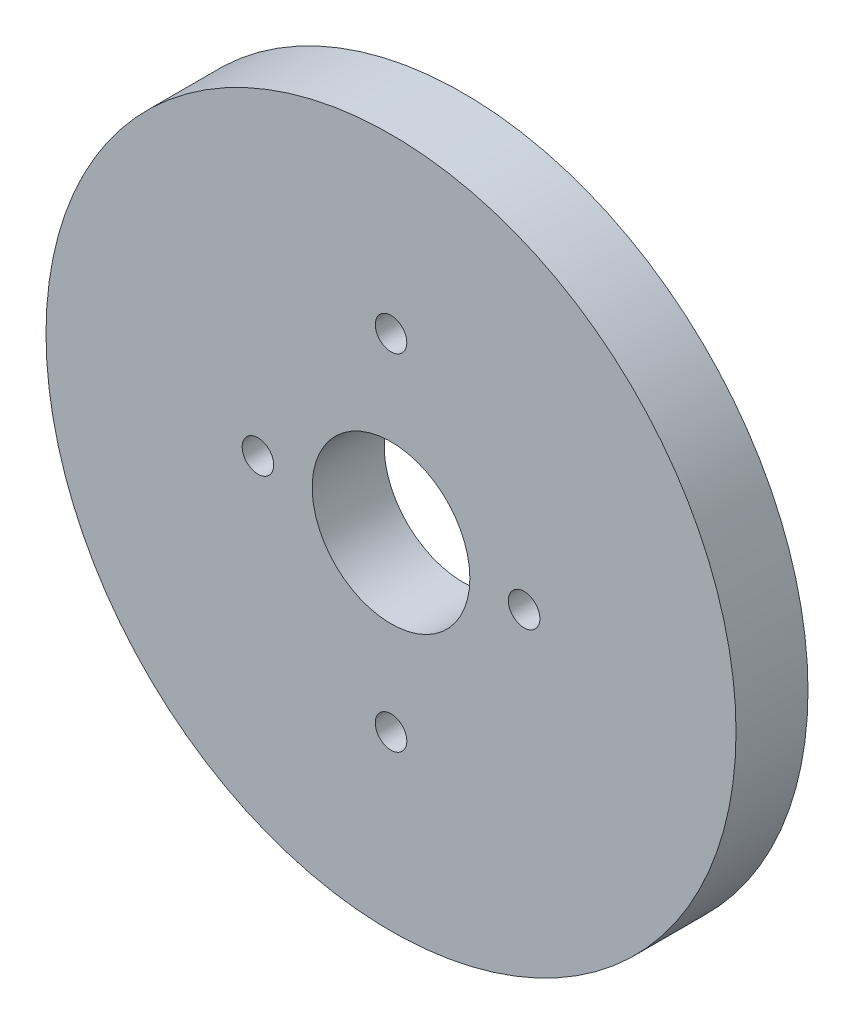
ISO-10303-21;
HEADER;
FILE_DESCRIPTION(('STEP AP214'),'2;1');
FILE_NAME('part.step','',(''),(''),'','','');
FILE_SCHEMA(('AUTOMOTIVE_DESIGN { 1 0 10303 214 1 1 1 1 }'));
ENDSEC;
DATA;
#1=APPLICATION_CONTEXT('core data for automotive mechanical design processes');
#2=APPLICATION_PROTOCOL_DEFINITION('international standard','automotive_design',2000,#1);
#3=PRODUCT_CONTEXT('',#1,'mechanical');
#4=PRODUCT('Part','Part','',(#3));
#5=PRODUCT_RELATED_PRODUCT_CATEGORY('part','',(#4));
#6=PRODUCT_DEFINITION_FORMATION('','',#4);
#7=PRODUCT_DEFINITION_CONTEXT('part definition',#1,'design');
#8=PRODUCT_DEFINITION('design','',#6,#7);
#9=PRODUCT_DEFINITION_SHAPE('','',#8);
#10=(LENGTH_UNIT() NAMED_UNIT(*) SI_UNIT(.MILLI.,.METRE.));
#11=(NAMED_UNIT(*) PLANE_ANGLE_UNIT() SI_UNIT($,.RADIAN.));
#12=(NAMED_UNIT(*) SI_UNIT($,.STERADIAN.) SOLID_ANGLE_UNIT());
#13=UNCERTAINTY_MEASURE_WITH_UNIT(LENGTH_MEASURE(1.E-05),#10,'distance_accuracy_value','');
#14=(GEOMETRIC_REPRESENTATION_CONTEXT(3) GLOBAL_UNCERTAINTY_ASSIGNED_CONTEXT((#13)) GLOBAL_UNIT_ASSIGNED_CONTEXT((#10,
#11,#12)) REPRESENTATION_CONTEXT('',''));
#15=CARTESIAN_POINT('',(0.,0.,0.));
#16=DIRECTION('',(0.,0.,1.));
#17=DIRECTION('',(1.,0.,0.));
#18=AXIS2_PLACEMENT_3D('',#15,#16,#17);
#19=CARTESIAN_POINT('',(0.,0.,3.65));
#20=DIRECTION('',(0.,0.,1.));
#21=DIRECTION('',(1.,0.,0.));
#22=AXIS2_PLACEMENT_3D('',#19,#20,#21);
#23=PLANE('',#22);
#24=CARTESIAN_POINT('',(0.,-8.75,3.65));
#25=DIRECTION('',(0.,0.,1.));
#26=DIRECTION('',(-1.,0.,0.));
#27=AXIS2_PLACEMENT_3D('',#24,#25,#26);
#28=CIRCLE('',#27,0.8);
#29=CARTESIAN_POINT('',(-0.8,-8.75,3.65));
#30=VERTEX_POINT('',#29);
#31=EDGE_CURVE('E67',#30,#30,#28,.T.);
#32=ORIENTED_EDGE('',*,*,#31,.F.);
#33=EDGE_LOOP('',(#32));
#34=FACE_BOUND('',#33,.T.);
#35=CARTESIAN_POINT('',(6.75,0.,3.65));
#36=DIRECTION('',(0.,0.,1.));
#37=DIRECTION('',(1.,0.,0.));
#38=AXIS2_PLACEMENT_3D('',#35,#36,#37);
#39=CIRCLE('',#38,0.8);
#40=CARTESIAN_POINT('',(7.55,0.,3.65));
#41=VERTEX_POINT('',#40);
#42=EDGE_CURVE('E55',#41,#41,#39,.T.);
#43=ORIENTED_EDGE('',*,*,#42,.F.);
#44=EDGE_LOOP('',(#43));
#45=FACE_BOUND('',#44,.T.);
#46=CARTESIAN_POINT('',(0.,0.,3.65));
#47=DIRECTION('',(0.,0.,1.));
#48=DIRECTION('',(1.,0.,0.));
#49=AXIS2_PLACEMENT_3D('',#46,#47,#48);
#50=CIRCLE('',#49,17.5);
#51=CARTESIAN_POINT('',(17.5,0.,3.65));
#52=VERTEX_POINT('',#51);
#53=EDGE_CURVE('E10',#52,#52,#50,.T.);
#54=ORIENTED_EDGE('',*,*,#53,.T.);
#55=EDGE_LOOP('',(#54));
#56=FACE_BOUND('',#55,.T.);
#57=CARTESIAN_POINT('',(0.,0.,3.65));
#58=DIRECTION('',(0.,0.,1.));
#59=DIRECTION('',(1.,0.,0.));
#60=AXIS2_PLACEMENT_3D('',#57,#58,#59);
#61=CIRCLE('',#60,4.);
#62=CARTESIAN_POINT('',(4.,0.,3.65));
#63=VERTEX_POINT('',#62);
#64=EDGE_CURVE('E50',#63,#63,#61,.T.);
#65=ORIENTED_EDGE('',*,*,#64,.F.);
#66=EDGE_LOOP('',(#65));
#67=FACE_BOUND('',#66,.T.);
#68=CARTESIAN_POINT('',(0.,8.75,3.65));
#69=DIRECTION('',(0.,0.,1.));
#70=DIRECTION('',(1.,0.,0.));
#71=AXIS2_PLACEMENT_3D('',#68,#69,#70);
#72=CIRCLE('',#71,0.8);
#73=CARTESIAN_POINT('',(0.8,8.75,3.65));
#74=VERTEX_POINT('',#73);
#75=EDGE_CURVE('E61',#74,#74,#72,.T.);
#76=ORIENTED_EDGE('',*,*,#75,.F.);
#77=EDGE_LOOP('',(#76));
#78=FACE_BOUND('',#77,.T.);
#79=CARTESIAN_POINT('',(-6.75,0.,3.65));
#80=DIRECTION('',(0.,0.,1.));
#81=DIRECTION('',(-1.,0.,0.));
#82=AXIS2_PLACEMENT_3D('',#79,#80,#81);
#83=CIRCLE('',#82,0.8);
#84=CARTESIAN_POINT('',(-7.55,0.,3.65));
#85=VERTEX_POINT('',#84);
#86=EDGE_CURVE('E73',#85,#85,#83,.T.);
#87=ORIENTED_EDGE('',*,*,#86,.F.);
#88=EDGE_LOOP('',(#87));
#89=FACE_BOUND('',#88,.T.);
#90=ADVANCED_FACE('F39',(#34,#45,#56,#67,#78,#89),#23,.T.);
#91=CARTESIAN_POINT('',(0.,0.,0.));
#92=DIRECTION('',(0.,0.,1.));
#93=DIRECTION('',(1.,0.,0.));
#94=AXIS2_PLACEMENT_3D('',#91,#92,#93);
#95=PLANE('',#94);
#96=CARTESIAN_POINT('',(0.,0.,0.));
#97=DIRECTION('',(0.,0.,1.));
#98=DIRECTION('',(1.,0.,0.));
#99=AXIS2_PLACEMENT_3D('',#96,#97,#98);
#100=CIRCLE('',#99,17.5);
#101=CARTESIAN_POINT('',(17.5,0.,0.));
#102=VERTEX_POINT('',#101);
#103=EDGE_CURVE('E43',#102,#102,#100,.T.);
#104=ORIENTED_EDGE('',*,*,#103,.F.);
#105=EDGE_LOOP('',(#104));
#106=FACE_BOUND('',#105,.T.);
#107=CARTESIAN_POINT('',(0.,0.,0.));
#108=DIRECTION('',(0.,0.,1.));
#109=DIRECTION('',(1.,0.,0.));
#110=AXIS2_PLACEMENT_3D('',#107,#108,#109);
#111=CIRCLE('',#110,4.);
#112=CARTESIAN_POINT('',(4.,0.,0.));
#113=VERTEX_POINT('',#112);
#114=EDGE_CURVE('E52',#113,#113,#111,.T.);
#115=ORIENTED_EDGE('',*,*,#114,.T.);
#116=EDGE_LOOP('',(#115));
#117=FACE_BOUND('',#116,.T.);
#118=CARTESIAN_POINT('',(6.75,0.,0.));
#119=DIRECTION('',(0.,0.,1.));
#120=DIRECTION('',(1.,0.,0.));
#121=AXIS2_PLACEMENT_3D('',#118,#119,#120);
#122=CIRCLE('',#121,0.8);
#123=CARTESIAN_POINT('',(7.55,0.,0.));
#124=VERTEX_POINT('',#123);
#125=EDGE_CURVE('E58',#124,#124,#122,.T.);
#126=ORIENTED_EDGE('',*,*,#125,.T.);
#127=EDGE_LOOP('',(#126));
#128=FACE_BOUND('',#127,.T.);
#129=CARTESIAN_POINT('',(0.,8.75,0.));
#130=DIRECTION('',(0.,0.,1.));
#131=DIRECTION('',(1.,0.,0.));
#132=AXIS2_PLACEMENT_3D('',#129,#130,#131);
#133=CIRCLE('',#132,0.8);
#134=CARTESIAN_POINT('',(0.8,8.75,0.));
#135=VERTEX_POINT('',#134);
#136=EDGE_CURVE('E64',#135,#135,#133,.T.);
#137=ORIENTED_EDGE('',*,*,#136,.T.);
#138=EDGE_LOOP('',(#137));
#139=FACE_BOUND('',#138,.T.);
#140=CARTESIAN_POINT('',(0.,-8.75,0.));
#141=DIRECTION('',(0.,0.,1.));
#142=DIRECTION('',(-1.,0.,0.));
#143=AXIS2_PLACEMENT_3D('',#140,#141,#142);
#144=CIRCLE('',#143,0.8);
#145=CARTESIAN_POINT('',(-0.8,-8.75,0.));
#146=VERTEX_POINT('',#145);
#147=EDGE_CURVE('E70',#146,#146,#144,.T.);
#148=ORIENTED_EDGE('',*,*,#147,.T.);
#149=EDGE_LOOP('',(#148));
#150=FACE_BOUND('',#149,.T.);
#151=CARTESIAN_POINT('',(-6.75,0.,0.));
#152=DIRECTION('',(0.,0.,1.));
#153=DIRECTION('',(-1.,0.,0.));
#154=AXIS2_PLACEMENT_3D('',#151,#152,#153);
#155=CIRCLE('',#154,0.8);
#156=CARTESIAN_POINT('',(-7.55,0.,0.));
#157=VERTEX_POINT('',#156);
#158=EDGE_CURVE('E76',#157,#157,#155,.T.);
#159=ORIENTED_EDGE('',*,*,#158,.T.);
#160=EDGE_LOOP('',(#159));
#161=FACE_BOUND('',#160,.T.);
#162=ADVANCED_FACE('F86',(#106,#117,#128,#139,#150,#161),#95,.F.);
#163=CARTESIAN_POINT('',(0.,0.,3.65));
#164=DIRECTION('',(0.,0.,-1.));
#165=DIRECTION('',(-1.,0.,0.));
#166=AXIS2_PLACEMENT_3D('',#163,#164,#165);
#167=CYLINDRICAL_SURFACE('',#166,17.5);
#168=ORIENTED_EDGE('',*,*,#53,.F.);
#169=EDGE_LOOP('',(#168));
#170=FACE_BOUND('',#169,.T.);
#171=ORIENTED_EDGE('',*,*,#103,.T.);
#172=EDGE_LOOP('',(#171));
#173=FACE_BOUND('',#172,.T.);
#174=ADVANCED_FACE('F41',(#170,#173),#167,.T.);
#175=CARTESIAN_POINT('',(0.,0.,3.65));
#176=DIRECTION('',(0.,0.,-1.));
#177=DIRECTION('',(-1.,0.,0.));
#178=AXIS2_PLACEMENT_3D('',#175,#176,#177);
#179=CYLINDRICAL_SURFACE('',#178,4.);
#180=ORIENTED_EDGE('',*,*,#64,.T.);
#181=EDGE_LOOP('',(#180));
#182=FACE_BOUND('',#181,.T.);
#183=ORIENTED_EDGE('',*,*,#114,.F.);
#184=EDGE_LOOP('',(#183));
#185=FACE_BOUND('',#184,.T.);
#186=ADVANCED_FACE('F96',(#182,#185),#179,.F.);
#187=CARTESIAN_POINT('',(6.75,0.,3.65));
#188=DIRECTION('',(0.,0.,-1.));
#189=DIRECTION('',(-1.,0.,0.));
#190=AXIS2_PLACEMENT_3D('',#187,#188,#189);
#191=CYLINDRICAL_SURFACE('',#190,0.8);
#192=ORIENTED_EDGE('',*,*,#42,.T.);
#193=EDGE_LOOP('',(#192));
#194=FACE_BOUND('',#193,.T.);
#195=ORIENTED_EDGE('',*,*,#125,.F.);
#196=EDGE_LOOP('',(#195));
#197=FACE_BOUND('',#196,.T.);
#198=ADVANCED_FACE('F99',(#194,#197),#191,.F.);
#199=CARTESIAN_POINT('',(0.,8.75,3.65));
#200=DIRECTION('',(0.,0.,-1.));
#201=DIRECTION('',(-1.,0.,0.));
#202=AXIS2_PLACEMENT_3D('',#199,#200,#201);
#203=CYLINDRICAL_SURFACE('',#202,0.8);
#204=ORIENTED_EDGE('',*,*,#75,.T.);
#205=EDGE_LOOP('',(#204));
#206=FACE_BOUND('',#205,.T.);
#207=ORIENTED_EDGE('',*,*,#136,.F.);
#208=EDGE_LOOP('',(#207));
#209=FACE_BOUND('',#208,.T.);
#210=ADVANCED_FACE('F103',(#206,#209),#203,.F.);
#211=CARTESIAN_POINT('',(0.,-8.75,3.65));
#212=DIRECTION('',(0.,0.,-1.));
#213=DIRECTION('',(-1.,0.,0.));
#214=AXIS2_PLACEMENT_3D('',#211,#212,#213);
#215=CYLINDRICAL_SURFACE('',#214,0.8);
#216=ORIENTED_EDGE('',*,*,#31,.T.);
#217=EDGE_LOOP('',(#216));
#218=FACE_BOUND('',#217,.T.);
#219=ORIENTED_EDGE('',*,*,#147,.F.);
#220=EDGE_LOOP('',(#219));
#221=FACE_BOUND('',#220,.T.);
#222=ADVANCED_FACE('F107',(#218,#221),#215,.F.);
#223=CARTESIAN_POINT('',(-6.75,0.,3.65));
#224=DIRECTION('',(0.,0.,-1.));
#225=DIRECTION('',(-1.,0.,0.));
#226=AXIS2_PLACEMENT_3D('',#223,#224,#225);
#227=CYLINDRICAL_SURFACE('',#226,0.8);
#228=ORIENTED_EDGE('',*,*,#86,.T.);
#229=EDGE_LOOP('',(#228));
#230=FACE_BOUND('',#229,.T.);
#231=ORIENTED_EDGE('',*,*,#158,.F.);
#232=EDGE_LOOP('',(#231));
#233=FACE_BOUND('',#232,.T.);
#234=ADVANCED_FACE('F82',(#230,#233),#227,.F.);
#235=CLOSED_SHELL('',(#90,#162,#174,#186,#198,#210,#222,#234));
#236=MANIFOLD_SOLID_BREP('B2',#235);
#237=ADVANCED_BREP_SHAPE_REPRESENTATION('',(#18,#236),#14);
#238=SHAPE_DEFINITION_REPRESENTATION(#9,#237);
ENDSEC;
END-ISO-10303-21;
